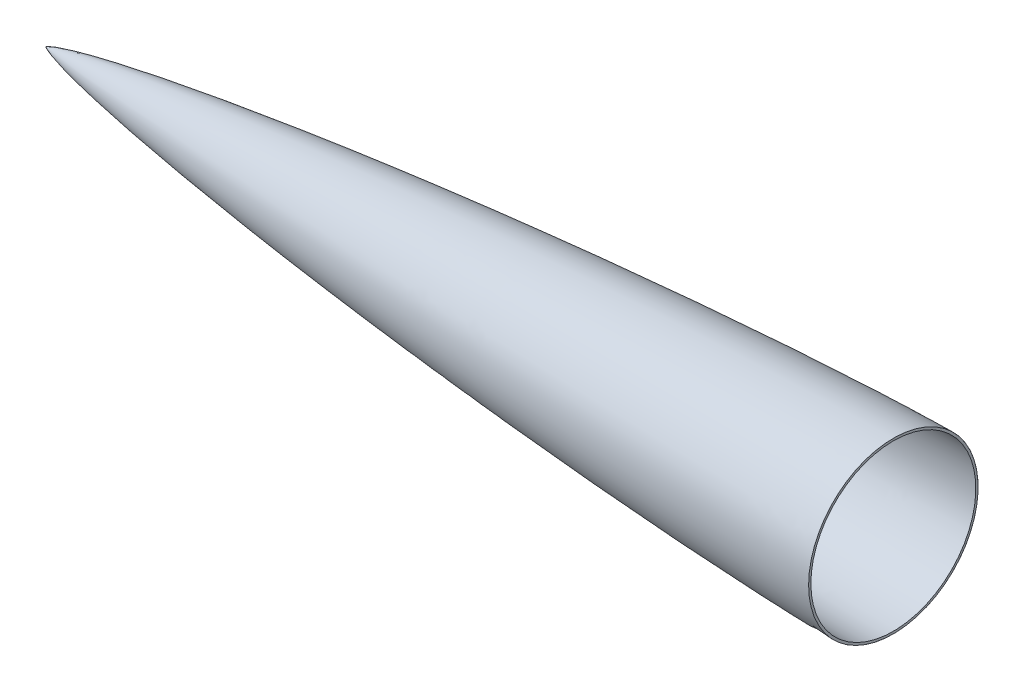
ISO-10303-21;
HEADER;
FILE_DESCRIPTION(('STEP AP214'),'2;1');
FILE_NAME('part.step','',(''),(''),'','','');
FILE_SCHEMA(('AUTOMOTIVE_DESIGN { 1 0 10303 214 1 1 1 1 }'));
ENDSEC;
DATA;
#1=APPLICATION_CONTEXT('core data for automotive mechanical design processes');
#2=APPLICATION_PROTOCOL_DEFINITION('international standard','automotive_design',2000,#1);
#3=PRODUCT_CONTEXT('',#1,'mechanical');
#4=PRODUCT('Part','Part','',(#3));
#5=PRODUCT_RELATED_PRODUCT_CATEGORY('part','',(#4));
#6=PRODUCT_DEFINITION_FORMATION('','',#4);
#7=PRODUCT_DEFINITION_CONTEXT('part definition',#1,'design');
#8=PRODUCT_DEFINITION('design','',#6,#7);
#9=PRODUCT_DEFINITION_SHAPE('','',#8);
#10=(LENGTH_UNIT() NAMED_UNIT(*) SI_UNIT(.MILLI.,.METRE.));
#11=(NAMED_UNIT(*) PLANE_ANGLE_UNIT() SI_UNIT($,.RADIAN.));
#12=(NAMED_UNIT(*) SI_UNIT($,.STERADIAN.) SOLID_ANGLE_UNIT());
#13=UNCERTAINTY_MEASURE_WITH_UNIT(LENGTH_MEASURE(1.E-05),#10,'distance_accuracy_value','');
#14=(GEOMETRIC_REPRESENTATION_CONTEXT(3) GLOBAL_UNCERTAINTY_ASSIGNED_CONTEXT((#13)) GLOBAL_UNIT_ASSIGNED_CONTEXT((#10,
#11,#12)) REPRESENTATION_CONTEXT('',''));
#15=CARTESIAN_POINT('',(0.,0.,0.));
#16=DIRECTION('',(0.,0.,1.));
#17=DIRECTION('',(1.,0.,0.));
#18=AXIS2_PLACEMENT_3D('',#15,#16,#17);
#19=CARTESIAN_POINT('',(4.55255559662651,-1.2490009027033E-13,0.));
#20=CARTESIAN_POINT('',(5.44501822248942,0.324851788629555,0.));
#21=CARTESIAN_POINT('',(7.23898594866551,0.923010218210394,0.));
#22=CARTESIAN_POINT('',(10.9288793169086,2.03507692878704,0.));
#23=CARTESIAN_POINT('',(17.4708233279147,3.79604957212884,0.));
#24=CARTESIAN_POINT('',(26.9444509258836,6.01746865774617,0.));
#25=CARTESIAN_POINT('',(38.387109119554,8.42408168596899,0.));
#26=CARTESIAN_POINT('',(53.7067145864465,11.3983222852598,0.));
#27=CARTESIAN_POINT('',(72.9318464242256,14.7924565751425,0.));
#28=CARTESIAN_POINT('',(96.0679193127071,18.5264655761925,0.));
#29=CARTESIAN_POINT('',(119.249807277512,22.0067242795963,0.));
#30=CARTESIAN_POINT('',(150.202374056571,26.3763949524286,0.));
#31=CARTESIAN_POINT('',(188.957280340385,31.415002086778,0.));
#32=CARTESIAN_POINT('',(235.531471027209,36.9453759984736,0.));
#33=CARTESIAN_POINT('',(282.157954730664,42.0423484780293,0.));
#34=CARTESIAN_POINT('',(328.825989737068,46.7595465571872,0.));
#35=CARTESIAN_POINT('',(391.09673915609,52.583813796635,0.));
#36=CARTESIAN_POINT('',(469.010319036694,59.0426646133885,0.));
#37=CARTESIAN_POINT('',(547.00435964903,64.4339284328495,0.));
#38=CARTESIAN_POINT('',(609.441331188594,68.0318537873303,0.));
#39=CARTESIAN_POINT('',(656.287575483018,70.3249807623154,0.));
#40=CARTESIAN_POINT('',(695.342084636933,71.8297049623382,0.));
#41=CARTESIAN_POINT('',(722.680234863539,72.5862970121678,0.));
#42=CARTESIAN_POINT('',(738.305795073809,72.8883389009082,0.));
#43=CARTESIAN_POINT('',(746.103809692368,72.9903065154606,0.));
#44=CARTESIAN_POINT('',(750.004972689675,73.0000061819202,0.));
#45=B_SPLINE_CURVE_WITH_KNOTS('',3,(#19,#20,#21,#22,#23,#24,#25,#26,#27,#28,#29,#30,#31,#32,#33,
#34,#35,#36,#37,#38,#39,#40,#41,#42,#43,#44),.UNSPECIFIED.,.F.,.F.,(4,1,1,1,1,1,1,1,1,1,1,1,1,1,
1,1,1,1,1,1,1,1,1,4),(0.00573651817108958,0.00962035989698377,0.0135042016228779,
0.0212718850746663,0.036807251978243,0.0523426188818198,0.0678779857853965,0.0989487195925499,
0.130019453399703,0.161090187206857,0.19216092101401,0.254302388628317,0.316443856242624,
0.378585323856931,0.440726791471238,0.502868259085545,0.627151194314159,0.751434129542772,
0.813575597157079,0.875717064771386,0.937858532385693,0.968929266192847,0.984464633096423,1.),.UNSPECIFIED.);
#46=CARTESIAN_POINT('',(0.,0.,0.));
#47=DIRECTION('',(-1.,0.,0.));
#48=AXIS1_PLACEMENT('',#46,#47);
#49=SURFACE_OF_REVOLUTION('',#45,#48);
#50=CARTESIAN_POINT('',(750.004972689675,0.,0.));
#51=DIRECTION('',(-1.,0.,0.));
#52=DIRECTION('',(0.,0.,1.));
#53=AXIS2_PLACEMENT_3D('',#50,#51,#52);
#54=CIRCLE('',#53,73.0000061819202);
#55=CARTESIAN_POINT('',(750.004972689675,0.,73.0000061819202));
#56=VERTEX_POINT('',#55);
#57=EDGE_CURVE('E11',#56,#56,#54,.T.);
#58=ORIENTED_EDGE('',*,*,#57,.F.);
#59=EDGE_LOOP('',(#58));
#60=FACE_BOUND('',#59,.T.);
#61=CARTESIAN_POINT('',(4.55255559662651,-1.2490009027033E-13,0.));
#62=VERTEX_POINT('',#61);
#63=VERTEX_LOOP('',#62);
#64=FACE_BOUND('',#63,.T.);
#65=ADVANCED_FACE('F32',(#60,#64),#49,.T.);
#66=CARTESIAN_POINT('',(750.004972689675,0.,0.));
#67=DIRECTION('',(-1.,0.,0.));
#68=DIRECTION('',(0.,0.,1.));
#69=AXIS2_PLACEMENT_3D('',#66,#67,#68);
#70=PLANE('',#69);
#71=CARTESIAN_POINT('',(750.004972689675,0.,0.));
#72=DIRECTION('',(-1.,0.,0.));
#73=DIRECTION('',(0.,0.,1.));
#74=AXIS2_PLACEMENT_3D('',#71,#72,#73);
#75=CIRCLE('',#74,75.);
#76=CARTESIAN_POINT('',(750.004972689675,0.,75.));
#77=VERTEX_POINT('',#76);
#78=EDGE_CURVE('E40',#77,#77,#75,.T.);
#79=ORIENTED_EDGE('',*,*,#78,.F.);
#80=EDGE_LOOP('',(#79));
#81=FACE_BOUND('',#80,.T.);
#82=ORIENTED_EDGE('',*,*,#57,.T.);
#83=EDGE_LOOP('',(#82));
#84=FACE_BOUND('',#83,.T.);
#85=ADVANCED_FACE('F47',(#81,#84),#70,.F.);
#86=CARTESIAN_POINT('',(0.,0.,0.));
#87=DIRECTION('',(-1.,0.,0.));
#88=DIRECTION('',(0.,0.,1.));
#89=AXIS2_PLACEMENT_3D('',#86,#87,#88);
#90=CYLINDRICAL_SURFACE('',#89,75.);
#91=ORIENTED_EDGE('',*,*,#78,.T.);
#92=EDGE_LOOP('',(#91));
#93=FACE_BOUND('',#92,.T.);
#94=CARTESIAN_POINT('',(750.,0.,0.));
#95=DIRECTION('',(-1.,0.,0.));
#96=DIRECTION('',(0.,0.,1.));
#97=AXIS2_PLACEMENT_3D('',#94,#95,#96);
#98=CIRCLE('',#97,75.);
#99=CARTESIAN_POINT('',(750.,0.,75.));
#100=VERTEX_POINT('',#99);
#101=EDGE_CURVE('E74',#100,#100,#98,.T.);
#102=ORIENTED_EDGE('',*,*,#101,.F.);
#103=EDGE_LOOP('',(#102));
#104=FACE_BOUND('',#103,.T.);
#105=ADVANCED_FACE('F52',(#93,#104),#90,.T.);
#106=CARTESIAN_POINT('',(0.,0.,0.));
#107=CARTESIAN_POINT('',(0.00266136900277126,0.00735768035447828,0.));
#108=CARTESIAN_POINT('',(0.009108664279464,0.0214551764039801,0.));
#109=CARTESIAN_POINT('',(0.0268587388071308,0.0470228254409756,0.));
#110=CARTESIAN_POINT('',(0.0684192496442012,0.0933462352583666,0.));
#111=CARTESIAN_POINT('',(0.131428409377918,0.151025199859623,0.));
#112=CARTESIAN_POINT('',(0.21681071607859,0.218337029592316,0.));
#113=CARTESIAN_POINT('',(0.338162363800059,0.304110587338523,0.));
#114=CARTESIAN_POINT('',(0.483942430084849,0.397396691898671,0.));
#115=CARTESIAN_POINT('',(0.655054984604423,0.498068807239353,0.));
#116=CARTESIAN_POINT('',(0.851568564991962,0.605626997792396,0.));
#117=CARTESIAN_POINT('',(1.13765450888637,0.753350527780503,0.));
#118=CARTESIAN_POINT('',(1.58154368184054,0.96611355613081,0.));
#119=CARTESIAN_POINT('',(2.33505073344385,1.29612267156493,0.));
#120=CARTESIAN_POINT('',(3.68290156650669,1.82662928309066,0.));
#121=CARTESIAN_POINT('',(6.1114732518571,2.67447630921792,0.));
#122=CARTESIAN_POINT('',(10.5746283005517,4.03796826352014,0.));
#123=CARTESIAN_POINT('',(18.9517337425947,6.25200129558948,0.));
#124=CARTESIAN_POINT('',(33.5701005177866,9.56530408373436,0.));
#125=CARTESIAN_POINT('',(58.4066532494858,14.4078795871684,0.));
#126=CARTESIAN_POINT('',(92.5078740517947,20.1208836904551,0.));
#127=CARTESIAN_POINT('',(133.842049800857,26.225056742857,0.));
#128=CARTESIAN_POINT('',(179.80921473271,32.3064516469885,0.));
#129=CARTESIAN_POINT('',(225.842093130452,37.8632112496441,0.));
#130=CARTESIAN_POINT('',(271.92542262347,42.9839128159841,0.));
#131=CARTESIAN_POINT('',(318.049122539798,47.7252981201375,0.));
#132=CARTESIAN_POINT('',(364.207064365671,52.1206791562391,0.));
#133=CARTESIAN_POINT('',(410.394737334526,56.1910098663551,0.));
#134=CARTESIAN_POINT('',(456.60913198154,59.945893406079,0.));
#135=CARTESIAN_POINT('',(502.84798368011,63.3864786561486,0.));
#136=CARTESIAN_POINT('',(549.109760476806,66.504247950043,0.));
#137=CARTESIAN_POINT('',(595.39339259502,69.2797922239004,0.));
#138=CARTESIAN_POINT('',(635.910176338294,71.3773249155588,0.));
#139=CARTESIAN_POINT('',(670.652020800476,72.8985285063739,0.));
#140=CARTESIAN_POINT('',(698.668276380401,73.9065630771162,0.));
#141=CARTESIAN_POINT('',(717.528484440156,74.4580190848471,0.));
#142=CARTESIAN_POINT('',(733.022602024851,74.8040587568069,0.));
#143=CARTESIAN_POINT('',(742.723636446798,74.9480339774458,0.));
#144=CARTESIAN_POINT('',(747.57448889015,74.9939693243333,0.));
#145=CARTESIAN_POINT('',(750.,75.,0.));
#146=B_SPLINE_CURVE_WITH_KNOTS('',4,(#106,#107,#108,#109,#110,#111,#112,#113,#114,#115,#116,
#117,#118,#119,#120,#121,#122,#123,#124,#125,#126,#127,#128,#129,#130,#131,#132,#133,#134,#135,
#136,#137,#138,#139,#140,#141,#142,#143,#144,#145),.UNSPECIFIED.,.F.,.F.,(5,1,1,1,1,1,1,1,1,1,1,
1,1,1,1,1,1,1,1,1,1,1,1,1,1,1,1,1,1,1,1,1,1,1,1,1,5),(0.,4.11032787983853E-05,
8.22065575967706E-05,0.000164413115193541,0.000328826230387082,0.000493239345580623,
0.000657652460774165,0.000951493612859079,0.00124533476494399,0.00154479174871456,
0.00184424873248513,0.00265705719597522,0.00385252046802978,0.00590167698954035,
0.00951586252134179,0.0162807635228404,0.0285690036013013,0.0517938037720722,0.0889073662699192,
0.150314204867521,0.211721037868867,0.27312787179488,0.334534706421201,0.395941541348574,
0.457348376315495,0.518755211151345,0.580162045729082,0.641568880581467,0.702975716282403,
0.76438255141362,0.82578938585265,0.887196221542314,0.917899639147708,0.948603056753103,
0.974301528376551,0.987150764188276,1.),.UNSPECIFIED.);
#147=CARTESIAN_POINT('',(0.,0.,0.));
#148=DIRECTION('',(-1.,0.,0.));
#149=AXIS1_PLACEMENT('',#147,#148);
#150=SURFACE_OF_REVOLUTION('',#146,#149);
#151=ORIENTED_EDGE('',*,*,#101,.T.);
#152=EDGE_LOOP('',(#151));
#153=FACE_BOUND('',#152,.T.);
#154=CARTESIAN_POINT('',(0.,0.,0.));
#155=VERTEX_POINT('',#154);
#156=VERTEX_LOOP('',#155);
#157=FACE_BOUND('',#156,.T.);
#158=ADVANCED_FACE('F59',(#153,#157),#150,.F.);
#159=CLOSED_SHELL('',(#65,#85,#105,#158));
#160=MANIFOLD_SOLID_BREP('B2',#159);
#161=ADVANCED_BREP_SHAPE_REPRESENTATION('',(#18,#160),#14);
#162=SHAPE_DEFINITION_REPRESENTATION(#9,#161);
ENDSEC;
END-ISO-10303-21;
